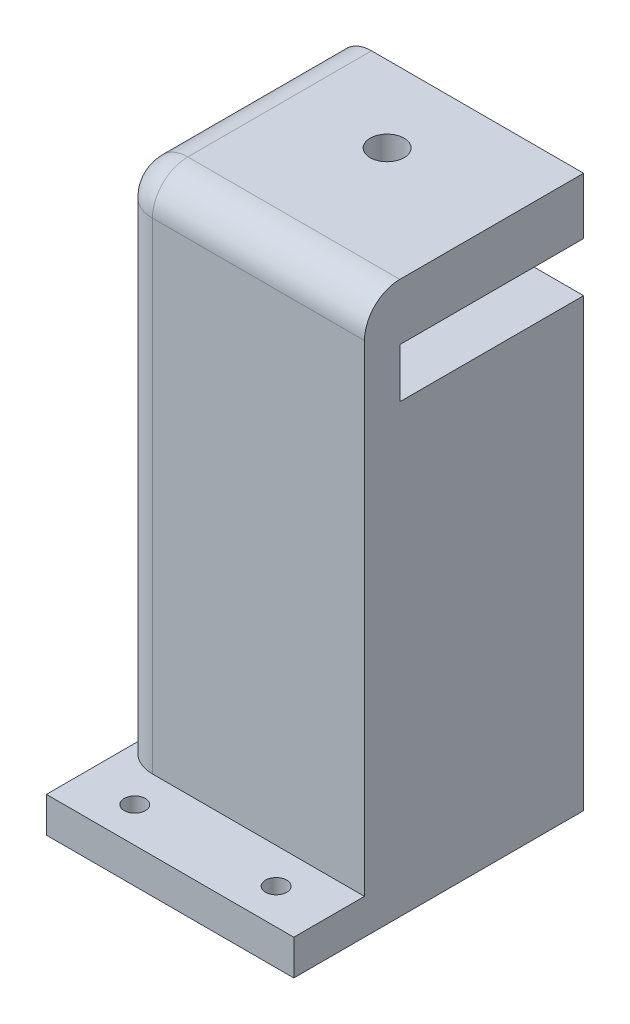
ISO-10303-21;
HEADER;
FILE_DESCRIPTION(('STEP AP214'),'2;1');
FILE_NAME('part.step','',(''),(''),'','','');
FILE_SCHEMA(('AUTOMOTIVE_DESIGN { 1 0 10303 214 1 1 1 1 }'));
ENDSEC;
DATA;
#1=APPLICATION_CONTEXT('core data for automotive mechanical design processes');
#2=APPLICATION_PROTOCOL_DEFINITION('international standard','automotive_design',2000,#1);
#3=PRODUCT_CONTEXT('',#1,'mechanical');
#4=PRODUCT('Part','Part','',(#3));
#5=PRODUCT_RELATED_PRODUCT_CATEGORY('part','',(#4));
#6=PRODUCT_DEFINITION_FORMATION('','',#4);
#7=PRODUCT_DEFINITION_CONTEXT('part definition',#1,'design');
#8=PRODUCT_DEFINITION('design','',#6,#7);
#9=PRODUCT_DEFINITION_SHAPE('','',#8);
#10=(LENGTH_UNIT() NAMED_UNIT(*) SI_UNIT(.MILLI.,.METRE.));
#11=(NAMED_UNIT(*) PLANE_ANGLE_UNIT() SI_UNIT($,.RADIAN.));
#12=(NAMED_UNIT(*) SI_UNIT($,.STERADIAN.) SOLID_ANGLE_UNIT());
#13=UNCERTAINTY_MEASURE_WITH_UNIT(LENGTH_MEASURE(1.E-05),#10,'distance_accuracy_value','');
#14=(GEOMETRIC_REPRESENTATION_CONTEXT(3) GLOBAL_UNCERTAINTY_ASSIGNED_CONTEXT((#13)) GLOBAL_UNIT_ASSIGNED_CONTEXT((#10,
#11,#12)) REPRESENTATION_CONTEXT('',''));
#15=CARTESIAN_POINT('',(0.,0.,0.));
#16=DIRECTION('',(0.,0.,1.));
#17=DIRECTION('',(1.,0.,0.));
#18=AXIS2_PLACEMENT_3D('',#15,#16,#17);
#19=CARTESIAN_POINT('',(0.,5.,0.));
#20=DIRECTION('',(0.,-1.,0.));
#21=DIRECTION('',(0.,0.,-1.));
#22=AXIS2_PLACEMENT_3D('',#19,#20,#21);
#23=PLANE('',#22);
#24=CARTESIAN_POINT('',(27.5,5.,-5.));
#25=DIRECTION('',(0.,1.,0.));
#26=DIRECTION('',(0.,0.,1.));
#27=AXIS2_PLACEMENT_3D('',#24,#25,#26);
#28=CIRCLE('',#27,1.5);
#29=CARTESIAN_POINT('',(27.5,5.,-3.5));
#30=VERTEX_POINT('',#29);
#31=EDGE_CURVE('E191',#30,#30,#28,.T.);
#32=ORIENTED_EDGE('',*,*,#31,.F.);
#33=EDGE_LOOP('',(#32));
#34=FACE_BOUND('',#33,.T.);
#35=CARTESIAN_POINT('',(7.5,5.,-5.));
#36=DIRECTION('',(0.,1.,0.));
#37=DIRECTION('',(0.,0.,1.));
#38=AXIS2_PLACEMENT_3D('',#35,#36,#37);
#39=CIRCLE('',#38,1.5);
#40=CARTESIAN_POINT('',(7.5,5.,-3.5));
#41=VERTEX_POINT('',#40);
#42=EDGE_CURVE('E196',#41,#41,#39,.T.);
#43=ORIENTED_EDGE('',*,*,#42,.F.);
#44=EDGE_LOOP('',(#43));
#45=FACE_BOUND('',#44,.T.);
#46=DIRECTION('',(1.,0.,0.));
#47=VECTOR('',#46,1.);
#48=CARTESIAN_POINT('',(0.,5.,-10.));
#49=LINE('',#48,#47);
#50=CARTESIAN_POINT('',(5.,5.,-10.));
#51=VERTEX_POINT('',#50);
#52=CARTESIAN_POINT('',(35.,5.,-10.));
#53=VERTEX_POINT('',#52);
#54=EDGE_CURVE('E178',#51,#53,#49,.T.);
#55=ORIENTED_EDGE('',*,*,#54,.F.);
#56=CARTESIAN_POINT('',(5.,5.,-15.));
#57=DIRECTION('',(0.,-1.,0.));
#58=DIRECTION('',(0.,0.,-1.));
#59=AXIS2_PLACEMENT_3D('',#56,#57,#58);
#60=CIRCLE('',#59,5.);
#61=CARTESIAN_POINT('',(0.,5.,-15.));
#62=VERTEX_POINT('',#61);
#63=EDGE_CURVE('E11',#51,#62,#60,.T.);
#64=ORIENTED_EDGE('',*,*,#63,.T.);
#65=DIRECTION('',(0.,0.,1.));
#66=VECTOR('',#65,1.);
#67=CARTESIAN_POINT('',(0.,5.,0.));
#68=LINE('',#67,#66);
#69=CARTESIAN_POINT('',(0.,5.,0.));
#70=VERTEX_POINT('',#69);
#71=EDGE_CURVE('E204',#62,#70,#68,.T.);
#72=ORIENTED_EDGE('',*,*,#71,.T.);
#73=DIRECTION('',(1.,0.,0.));
#74=VECTOR('',#73,1.);
#75=CARTESIAN_POINT('',(0.,5.,0.));
#76=LINE('',#75,#74);
#77=CARTESIAN_POINT('',(35.,5.,0.));
#78=VERTEX_POINT('',#77);
#79=EDGE_CURVE('E206',#70,#78,#76,.T.);
#80=ORIENTED_EDGE('',*,*,#79,.T.);
#81=DIRECTION('',(0.,0.,-1.));
#82=VECTOR('',#81,1.);
#83=CARTESIAN_POINT('',(35.,5.,0.));
#84=LINE('',#83,#82);
#85=EDGE_CURVE('E209',#78,#53,#84,.T.);
#86=ORIENTED_EDGE('',*,*,#85,.T.);
#87=EDGE_LOOP('',(#55,#64,#72,#80,#86));
#88=FACE_BOUND('',#87,.T.);
#89=ADVANCED_FACE('F43',(#34,#45,#88),#23,.F.);
#90=CARTESIAN_POINT('',(0.,5.,0.));
#91=DIRECTION('',(1.,0.,0.));
#92=DIRECTION('',(0.,0.,-1.));
#93=AXIS2_PLACEMENT_3D('',#90,#91,#92);
#94=PLANE('',#93);
#95=ORIENTED_EDGE('',*,*,#71,.F.);
#96=DIRECTION('',(0.,-1.,0.));
#97=VECTOR('',#96,1.);
#98=CARTESIAN_POINT('',(0.,5.,-15.));
#99=LINE('',#98,#97);
#100=CARTESIAN_POINT('',(0.,73.1,-15.));
#101=VERTEX_POINT('',#100);
#102=EDGE_CURVE('E244',#62,#101,#99,.F.);
#103=ORIENTED_EDGE('',*,*,#102,.T.);
#104=DIRECTION('',(0.,0.,1.));
#105=VECTOR('',#104,1.);
#106=CARTESIAN_POINT('',(0.,73.1,-41.));
#107=LINE('',#106,#105);
#108=CARTESIAN_POINT('',(0.,73.1,-41.));
#109=VERTEX_POINT('',#108);
#110=EDGE_CURVE('E235',#101,#109,#107,.F.);
#111=ORIENTED_EDGE('',*,*,#110,.T.);
#112=DIRECTION('',(0.,-1.,0.));
#113=VECTOR('',#112,1.);
#114=CARTESIAN_POINT('',(0.,5.,-41.));
#115=LINE('',#114,#113);
#116=CARTESIAN_POINT('',(0.,0.,-41.));
#117=VERTEX_POINT('',#116);
#118=EDGE_CURVE('E212',#109,#117,#115,.T.);
#119=ORIENTED_EDGE('',*,*,#118,.T.);
#120=DIRECTION('',(0.,0.,1.));
#121=VECTOR('',#120,1.);
#122=CARTESIAN_POINT('',(0.,0.,0.));
#123=LINE('',#122,#121);
#124=CARTESIAN_POINT('',(0.,0.,0.));
#125=VERTEX_POINT('',#124);
#126=EDGE_CURVE('E195',#117,#125,#123,.T.);
#127=ORIENTED_EDGE('',*,*,#126,.T.);
#128=DIRECTION('',(0.,-1.,0.));
#129=VECTOR('',#128,1.);
#130=CARTESIAN_POINT('',(0.,5.,0.));
#131=LINE('',#130,#129);
#132=EDGE_CURVE('E230',#70,#125,#131,.T.);
#133=ORIENTED_EDGE('',*,*,#132,.F.);
#134=EDGE_LOOP('',(#95,#103,#111,#119,#127,#133));
#135=FACE_BOUND('',#134,.T.);
#136=ADVANCED_FACE('F277',(#135),#94,.F.);
#137=CARTESIAN_POINT('',(0.,5.,0.));
#138=DIRECTION('',(0.,0.,-1.));
#139=DIRECTION('',(-1.,0.,0.));
#140=AXIS2_PLACEMENT_3D('',#137,#138,#139);
#141=PLANE('',#140);
#142=DIRECTION('',(1.,0.,0.));
#143=VECTOR('',#142,1.);
#144=CARTESIAN_POINT('',(0.,0.,0.));
#145=LINE('',#144,#143);
#146=CARTESIAN_POINT('',(35.,0.,0.));
#147=VERTEX_POINT('',#146);
#148=EDGE_CURVE('E215',#125,#147,#145,.T.);
#149=ORIENTED_EDGE('',*,*,#148,.T.);
#150=DIRECTION('',(0.,-1.,0.));
#151=VECTOR('',#150,1.);
#152=CARTESIAN_POINT('',(35.,5.,0.));
#153=LINE('',#152,#151);
#154=EDGE_CURVE('E227',#78,#147,#153,.T.);
#155=ORIENTED_EDGE('',*,*,#154,.F.);
#156=ORIENTED_EDGE('',*,*,#79,.F.);
#157=ORIENTED_EDGE('',*,*,#132,.T.);
#158=EDGE_LOOP('',(#149,#155,#156,#157));
#159=FACE_BOUND('',#158,.T.);
#160=ADVANCED_FACE('F283',(#159),#141,.F.);
#161=CARTESIAN_POINT('',(35.,5.,0.));
#162=DIRECTION('',(-1.,0.,0.));
#163=DIRECTION('',(0.,0.,1.));
#164=AXIS2_PLACEMENT_3D('',#161,#162,#163);
#165=PLANE('',#164);
#166=DIRECTION('',(0.,0.,-1.));
#167=VECTOR('',#166,1.);
#168=CARTESIAN_POINT('',(35.,78.1,-41.));
#169=LINE('',#168,#167);
#170=CARTESIAN_POINT('',(35.,78.1,-15.));
#171=VERTEX_POINT('',#170);
#172=CARTESIAN_POINT('',(35.,78.1,-41.));
#173=VERTEX_POINT('',#172);
#174=EDGE_CURVE('E182',#171,#173,#169,.T.);
#175=ORIENTED_EDGE('',*,*,#174,.F.);
#176=CARTESIAN_POINT('',(35.,73.1,-15.));
#177=DIRECTION('',(-1.,0.,0.));
#178=DIRECTION('',(0.,0.,1.));
#179=AXIS2_PLACEMENT_3D('',#176,#177,#178);
#180=CIRCLE('',#179,5.);
#181=CARTESIAN_POINT('',(35.,73.1,-10.));
#182=VERTEX_POINT('',#181);
#183=EDGE_CURVE('E52',#171,#182,#180,.F.);
#184=ORIENTED_EDGE('',*,*,#183,.T.);
#185=DIRECTION('',(0.,-1.,0.));
#186=VECTOR('',#185,1.);
#187=CARTESIAN_POINT('',(35.,78.1,-10.));
#188=LINE('',#187,#186);
#189=EDGE_CURVE('E187',#182,#53,#188,.T.);
#190=ORIENTED_EDGE('',*,*,#189,.T.);
#191=ORIENTED_EDGE('',*,*,#85,.F.);
#192=ORIENTED_EDGE('',*,*,#154,.T.);
#193=DIRECTION('',(0.,0.,-1.));
#194=VECTOR('',#193,1.);
#195=CARTESIAN_POINT('',(35.,0.,0.));
#196=LINE('',#195,#194);
#197=CARTESIAN_POINT('',(35.,0.,-41.));
#198=VERTEX_POINT('',#197);
#199=EDGE_CURVE('E217',#147,#198,#196,.T.);
#200=ORIENTED_EDGE('',*,*,#199,.T.);
#201=DIRECTION('',(0.,-1.,0.));
#202=VECTOR('',#201,1.);
#203=CARTESIAN_POINT('',(35.,5.,-41.));
#204=LINE('',#203,#202);
#205=CARTESIAN_POINT('',(35.,63.1,-41.));
#206=VERTEX_POINT('',#205);
#207=EDGE_CURVE('E223',#206,#198,#204,.T.);
#208=ORIENTED_EDGE('',*,*,#207,.F.);
#209=DIRECTION('',(0.,0.,-1.));
#210=VECTOR('',#209,1.);
#211=CARTESIAN_POINT('',(35.,63.1,-15.));
#212=LINE('',#211,#210);
#213=CARTESIAN_POINT('',(35.,63.1,-15.));
#214=VERTEX_POINT('',#213);
#215=EDGE_CURVE('E165',#214,#206,#212,.T.);
#216=ORIENTED_EDGE('',*,*,#215,.F.);
#217=DIRECTION('',(0.,-1.,0.));
#218=VECTOR('',#217,1.);
#219=CARTESIAN_POINT('',(35.,70.1,-15.));
#220=LINE('',#219,#218);
#221=CARTESIAN_POINT('',(35.,70.1,-15.));
#222=VERTEX_POINT('',#221);
#223=EDGE_CURVE('E146',#222,#214,#220,.T.);
#224=ORIENTED_EDGE('',*,*,#223,.F.);
#225=DIRECTION('',(0.,0.,1.));
#226=VECTOR('',#225,1.);
#227=CARTESIAN_POINT('',(35.,70.1,-15.));
#228=LINE('',#227,#226);
#229=CARTESIAN_POINT('',(35.,70.1,-41.));
#230=VERTEX_POINT('',#229);
#231=EDGE_CURVE('E162',#230,#222,#228,.T.);
#232=ORIENTED_EDGE('',*,*,#231,.F.);
#233=EDGE_CURVE('E224',#173,#230,#204,.T.);
#234=ORIENTED_EDGE('',*,*,#233,.F.);
#235=EDGE_LOOP('',(#175,#184,#190,#191,#192,#200,#208,#216,#224,#232,#234));
#236=FACE_BOUND('',#235,.T.);
#237=ADVANCED_FACE('F299',(#236),#165,.F.);
#238=CARTESIAN_POINT('',(0.,5.,-41.));
#239=DIRECTION('',(0.,0.,1.));
#240=DIRECTION('',(1.,0.,0.));
#241=AXIS2_PLACEMENT_3D('',#238,#239,#240);
#242=PLANE('',#241);
#243=ORIENTED_EDGE('',*,*,#118,.F.);
#244=CARTESIAN_POINT('',(5.,73.1,-41.));
#245=DIRECTION('',(0.,0.,1.));
#246=DIRECTION('',(1.,0.,0.));
#247=AXIS2_PLACEMENT_3D('',#244,#245,#246);
#248=CIRCLE('',#247,5.);
#249=CARTESIAN_POINT('',(5.,78.1,-41.));
#250=VERTEX_POINT('',#249);
#251=EDGE_CURVE('E237',#109,#250,#248,.F.);
#252=ORIENTED_EDGE('',*,*,#251,.T.);
#253=DIRECTION('',(-1.,0.,0.));
#254=VECTOR('',#253,1.);
#255=CARTESIAN_POINT('',(0.,78.1,-41.));
#256=LINE('',#255,#254);
#257=EDGE_CURVE('E184',#173,#250,#256,.T.);
#258=ORIENTED_EDGE('',*,*,#257,.F.);
#259=ORIENTED_EDGE('',*,*,#233,.T.);
#260=DIRECTION('',(1.,0.,0.));
#261=VECTOR('',#260,1.);
#262=CARTESIAN_POINT('',(5.,70.1,-41.));
#263=LINE('',#262,#261);
#264=CARTESIAN_POINT('',(5.,70.1,-41.));
#265=VERTEX_POINT('',#264);
#266=EDGE_CURVE('E179',#265,#230,#263,.T.);
#267=ORIENTED_EDGE('',*,*,#266,.F.);
#268=DIRECTION('',(0.,1.,0.));
#269=VECTOR('',#268,1.);
#270=CARTESIAN_POINT('',(5.,70.1,-41.));
#271=LINE('',#270,#269);
#272=CARTESIAN_POINT('',(5.,63.1,-41.));
#273=VERTEX_POINT('',#272);
#274=EDGE_CURVE('E158',#273,#265,#271,.T.);
#275=ORIENTED_EDGE('',*,*,#274,.F.);
#276=DIRECTION('',(1.,0.,0.));
#277=VECTOR('',#276,1.);
#278=CARTESIAN_POINT('',(5.,63.1,-41.));
#279=LINE('',#278,#277);
#280=EDGE_CURVE('E149',#273,#206,#279,.T.);
#281=ORIENTED_EDGE('',*,*,#280,.T.);
#282=ORIENTED_EDGE('',*,*,#207,.T.);
#283=DIRECTION('',(-1.,0.,0.));
#284=VECTOR('',#283,1.);
#285=CARTESIAN_POINT('',(0.,0.,-41.));
#286=LINE('',#285,#284);
#287=EDGE_CURVE('E207',#198,#117,#286,.T.);
#288=ORIENTED_EDGE('',*,*,#287,.T.);
#289=EDGE_LOOP('',(#243,#252,#258,#259,#267,#275,#281,#282,#288));
#290=FACE_BOUND('',#289,.T.);
#291=ADVANCED_FACE('F295',(#290),#242,.F.);
#292=CARTESIAN_POINT('',(0.,0.,0.));
#293=DIRECTION('',(0.,-1.,0.));
#294=DIRECTION('',(0.,0.,-1.));
#295=AXIS2_PLACEMENT_3D('',#292,#293,#294);
#296=PLANE('',#295);
#297=CARTESIAN_POINT('',(7.5,0.,-5.));
#298=DIRECTION('',(0.,1.,0.));
#299=DIRECTION('',(0.,0.,1.));
#300=AXIS2_PLACEMENT_3D('',#297,#298,#299);
#301=CIRCLE('',#300,1.5);
#302=CARTESIAN_POINT('',(7.5,0.,-3.5));
#303=VERTEX_POINT('',#302);
#304=EDGE_CURVE('E192',#303,#303,#301,.T.);
#305=ORIENTED_EDGE('',*,*,#304,.T.);
#306=EDGE_LOOP('',(#305));
#307=FACE_BOUND('',#306,.T.);
#308=CARTESIAN_POINT('',(27.5,0.,-5.));
#309=DIRECTION('',(0.,1.,0.));
#310=DIRECTION('',(0.,0.,1.));
#311=AXIS2_PLACEMENT_3D('',#308,#309,#310);
#312=CIRCLE('',#311,1.5);
#313=CARTESIAN_POINT('',(27.5,0.,-3.5));
#314=VERTEX_POINT('',#313);
#315=EDGE_CURVE('E199',#314,#314,#312,.T.);
#316=ORIENTED_EDGE('',*,*,#315,.T.);
#317=EDGE_LOOP('',(#316));
#318=FACE_BOUND('',#317,.T.);
#319=ORIENTED_EDGE('',*,*,#126,.F.);
#320=ORIENTED_EDGE('',*,*,#287,.F.);
#321=ORIENTED_EDGE('',*,*,#199,.F.);
#322=ORIENTED_EDGE('',*,*,#148,.F.);
#323=EDGE_LOOP('',(#319,#320,#321,#322));
#324=FACE_BOUND('',#323,.T.);
#325=ADVANCED_FACE('F292',(#307,#318,#324),#296,.T.);
#326=CARTESIAN_POINT('',(27.5,0.,-5.));
#327=DIRECTION('',(0.,1.,0.));
#328=DIRECTION('',(0.,0.,1.));
#329=AXIS2_PLACEMENT_3D('',#326,#327,#328);
#330=CYLINDRICAL_SURFACE('',#329,1.5);
#331=ORIENTED_EDGE('',*,*,#315,.F.);
#332=EDGE_LOOP('',(#331));
#333=FACE_BOUND('',#332,.T.);
#334=ORIENTED_EDGE('',*,*,#31,.T.);
#335=EDGE_LOOP('',(#334));
#336=FACE_BOUND('',#335,.T.);
#337=ADVANCED_FACE('F290',(#333,#336),#330,.F.);
#338=CARTESIAN_POINT('',(7.5,0.,-5.));
#339=DIRECTION('',(0.,1.,0.));
#340=DIRECTION('',(0.,0.,1.));
#341=AXIS2_PLACEMENT_3D('',#338,#339,#340);
#342=CYLINDRICAL_SURFACE('',#341,1.5);
#343=ORIENTED_EDGE('',*,*,#304,.F.);
#344=EDGE_LOOP('',(#343));
#345=FACE_BOUND('',#344,.T.);
#346=ORIENTED_EDGE('',*,*,#42,.T.);
#347=EDGE_LOOP('',(#346));
#348=FACE_BOUND('',#347,.T.);
#349=ADVANCED_FACE('F348',(#345,#348),#342,.F.);
#350=CARTESIAN_POINT('',(0.,78.1,-10.));
#351=DIRECTION('',(0.,0.,-1.));
#352=DIRECTION('',(-1.,0.,0.));
#353=AXIS2_PLACEMENT_3D('',#350,#351,#352);
#354=PLANE('',#353);
#355=DIRECTION('',(1.,0.,0.));
#356=VECTOR('',#355,1.);
#357=CARTESIAN_POINT('',(5.,73.1,-10.));
#358=LINE('',#357,#356);
#359=CARTESIAN_POINT('',(5.,73.1,-10.));
#360=VERTEX_POINT('',#359);
#361=EDGE_CURVE('E239',#182,#360,#358,.F.);
#362=ORIENTED_EDGE('',*,*,#361,.T.);
#363=DIRECTION('',(0.,-1.,0.));
#364=VECTOR('',#363,1.);
#365=CARTESIAN_POINT('',(5.,78.1,-10.));
#366=LINE('',#365,#364);
#367=EDGE_CURVE('E241',#360,#51,#366,.T.);
#368=ORIENTED_EDGE('',*,*,#367,.T.);
#369=ORIENTED_EDGE('',*,*,#54,.T.);
#370=ORIENTED_EDGE('',*,*,#189,.F.);
#371=EDGE_LOOP('',(#362,#368,#369,#370));
#372=FACE_BOUND('',#371,.T.);
#373=ADVANCED_FACE('F323',(#372),#354,.F.);
#374=CARTESIAN_POINT('',(0.,78.1,0.));
#375=DIRECTION('',(0.,1.,0.));
#376=DIRECTION('',(0.,0.,1.));
#377=AXIS2_PLACEMENT_3D('',#374,#375,#376);
#378=PLANE('',#377);
#379=CARTESIAN_POINT('',(18.,78.1,-30.202102686173));
#380=DIRECTION('',(0.,1.,0.));
#381=DIRECTION('',(0.,0.,1.));
#382=AXIS2_PLACEMENT_3D('',#379,#380,#381);
#383=CIRCLE('',#382,2.4);
#384=CARTESIAN_POINT('',(18.,78.1,-27.802102686173));
#385=VERTEX_POINT('',#384);
#386=EDGE_CURVE('E168',#385,#385,#383,.T.);
#387=ORIENTED_EDGE('',*,*,#386,.F.);
#388=EDGE_LOOP('',(#387));
#389=FACE_BOUND('',#388,.T.);
#390=DIRECTION('',(0.,0.,1.));
#391=VECTOR('',#390,1.);
#392=CARTESIAN_POINT('',(5.,78.1,-10.));
#393=LINE('',#392,#391);
#394=CARTESIAN_POINT('',(5.,78.1,-15.));
#395=VERTEX_POINT('',#394);
#396=EDGE_CURVE('E233',#250,#395,#393,.T.);
#397=ORIENTED_EDGE('',*,*,#396,.T.);
#398=DIRECTION('',(1.,0.,0.));
#399=VECTOR('',#398,1.);
#400=CARTESIAN_POINT('',(35.,78.1,-15.));
#401=LINE('',#400,#399);
#402=EDGE_CURVE('E60',#395,#171,#401,.T.);
#403=ORIENTED_EDGE('',*,*,#402,.T.);
#404=ORIENTED_EDGE('',*,*,#174,.T.);
#405=ORIENTED_EDGE('',*,*,#257,.T.);
#406=EDGE_LOOP('',(#397,#403,#404,#405));
#407=FACE_BOUND('',#406,.T.);
#408=ADVANCED_FACE('F338',(#389,#407),#378,.T.);
#409=CARTESIAN_POINT('',(5.,70.1,-15.));
#410=DIRECTION('',(0.,0.,1.));
#411=DIRECTION('',(0.,-1.,0.));
#412=AXIS2_PLACEMENT_3D('',#409,#410,#411);
#413=PLANE('',#412);
#414=ORIENTED_EDGE('',*,*,#223,.T.);
#415=DIRECTION('',(1.,0.,0.));
#416=VECTOR('',#415,1.);
#417=CARTESIAN_POINT('',(5.,63.1,-15.));
#418=LINE('',#417,#416);
#419=CARTESIAN_POINT('',(5.,63.1,-15.));
#420=VERTEX_POINT('',#419);
#421=EDGE_CURVE('E139',#420,#214,#418,.T.);
#422=ORIENTED_EDGE('',*,*,#421,.F.);
#423=DIRECTION('',(0.,-1.,0.));
#424=VECTOR('',#423,1.);
#425=CARTESIAN_POINT('',(5.,70.1,-15.));
#426=LINE('',#425,#424);
#427=CARTESIAN_POINT('',(5.,70.1,-15.));
#428=VERTEX_POINT('',#427);
#429=EDGE_CURVE('E143',#428,#420,#426,.T.);
#430=ORIENTED_EDGE('',*,*,#429,.F.);
#431=DIRECTION('',(1.,0.,0.));
#432=VECTOR('',#431,1.);
#433=CARTESIAN_POINT('',(5.,70.1,-15.));
#434=LINE('',#433,#432);
#435=EDGE_CURVE('E176',#428,#222,#434,.T.);
#436=ORIENTED_EDGE('',*,*,#435,.T.);
#437=EDGE_LOOP('',(#414,#422,#430,#436));
#438=FACE_BOUND('',#437,.T.);
#439=ADVANCED_FACE('F141',(#438),#413,.F.);
#440=CARTESIAN_POINT('',(5.,70.1,-15.));
#441=DIRECTION('',(0.,1.,0.));
#442=DIRECTION('',(0.,0.,1.));
#443=AXIS2_PLACEMENT_3D('',#440,#441,#442);
#444=PLANE('',#443);
#445=CARTESIAN_POINT('',(18.,70.1,-30.202102686173));
#446=DIRECTION('',(0.,1.,0.));
#447=DIRECTION('',(0.,0.,1.));
#448=AXIS2_PLACEMENT_3D('',#445,#446,#447);
#449=CIRCLE('',#448,2.4);
#450=CARTESIAN_POINT('',(18.,70.1,-27.802102686173));
#451=VERTEX_POINT('',#450);
#452=EDGE_CURVE('E174',#451,#451,#449,.T.);
#453=ORIENTED_EDGE('',*,*,#452,.T.);
#454=EDGE_LOOP('',(#453));
#455=FACE_BOUND('',#454,.T.);
#456=ORIENTED_EDGE('',*,*,#231,.T.);
#457=ORIENTED_EDGE('',*,*,#435,.F.);
#458=DIRECTION('',(0.,0.,1.));
#459=VECTOR('',#458,1.);
#460=CARTESIAN_POINT('',(5.,70.1,-15.));
#461=LINE('',#460,#459);
#462=EDGE_CURVE('E150',#265,#428,#461,.T.);
#463=ORIENTED_EDGE('',*,*,#462,.F.);
#464=ORIENTED_EDGE('',*,*,#266,.T.);
#465=EDGE_LOOP('',(#456,#457,#463,#464));
#466=FACE_BOUND('',#465,.T.);
#467=ADVANCED_FACE('F263',(#455,#466),#444,.F.);
#468=CARTESIAN_POINT('',(5.,63.1,-15.));
#469=DIRECTION('',(0.,-1.,0.));
#470=DIRECTION('',(0.,0.,-1.));
#471=AXIS2_PLACEMENT_3D('',#468,#469,#470);
#472=PLANE('',#471);
#473=ORIENTED_EDGE('',*,*,#215,.T.);
#474=ORIENTED_EDGE('',*,*,#280,.F.);
#475=DIRECTION('',(0.,0.,-1.));
#476=VECTOR('',#475,1.);
#477=CARTESIAN_POINT('',(5.,63.1,-15.));
#478=LINE('',#477,#476);
#479=EDGE_CURVE('E153',#420,#273,#478,.T.);
#480=ORIENTED_EDGE('',*,*,#479,.F.);
#481=ORIENTED_EDGE('',*,*,#421,.T.);
#482=EDGE_LOOP('',(#473,#474,#480,#481));
#483=FACE_BOUND('',#482,.T.);
#484=ADVANCED_FACE('F154',(#483),#472,.F.);
#485=CARTESIAN_POINT('',(5.,0.,0.));
#486=DIRECTION('',(1.,0.,0.));
#487=DIRECTION('',(0.,0.,-1.));
#488=AXIS2_PLACEMENT_3D('',#485,#486,#487);
#489=PLANE('',#488);
#490=ORIENTED_EDGE('',*,*,#429,.T.);
#491=ORIENTED_EDGE('',*,*,#479,.T.);
#492=ORIENTED_EDGE('',*,*,#274,.T.);
#493=ORIENTED_EDGE('',*,*,#462,.T.);
#494=EDGE_LOOP('',(#490,#491,#492,#493));
#495=FACE_BOUND('',#494,.T.);
#496=ADVANCED_FACE('F160',(#495),#489,.T.);
#497=CARTESIAN_POINT('',(18.,70.1,-30.202102686173));
#498=DIRECTION('',(0.,1.,0.));
#499=DIRECTION('',(0.,0.,1.));
#500=AXIS2_PLACEMENT_3D('',#497,#498,#499);
#501=CYLINDRICAL_SURFACE('',#500,2.4);
#502=ORIENTED_EDGE('',*,*,#452,.F.);
#503=EDGE_LOOP('',(#502));
#504=FACE_BOUND('',#503,.T.);
#505=ORIENTED_EDGE('',*,*,#386,.T.);
#506=EDGE_LOOP('',(#505));
#507=FACE_BOUND('',#506,.T.);
#508=ADVANCED_FACE('F266',(#504,#507),#501,.F.);
#509=CARTESIAN_POINT('',(5.,73.1,0.));
#510=DIRECTION('',(0.,0.,-1.));
#511=DIRECTION('',(-1.,0.,0.));
#512=AXIS2_PLACEMENT_3D('',#509,#510,#511);
#513=CYLINDRICAL_SURFACE('',#512,5.);
#514=ORIENTED_EDGE('',*,*,#110,.F.);
#515=CARTESIAN_POINT('',(5.,73.1,-15.));
#516=DIRECTION('',(0.,0.,-1.));
#517=DIRECTION('',(-1.,0.,0.));
#518=AXIS2_PLACEMENT_3D('',#515,#516,#517);
#519=CIRCLE('',#518,5.);
#520=EDGE_CURVE('E68',#101,#395,#519,.T.);
#521=ORIENTED_EDGE('',*,*,#520,.T.);
#522=ORIENTED_EDGE('',*,*,#396,.F.);
#523=ORIENTED_EDGE('',*,*,#251,.F.);
#524=EDGE_LOOP('',(#514,#521,#522,#523));
#525=FACE_BOUND('',#524,.T.);
#526=ADVANCED_FACE('F268',(#525),#513,.T.);
#527=CARTESIAN_POINT('',(0.,73.1,-15.));
#528=DIRECTION('',(-1.,0.,0.));
#529=DIRECTION('',(0.,0.,1.));
#530=AXIS2_PLACEMENT_3D('',#527,#528,#529);
#531=CYLINDRICAL_SURFACE('',#530,5.);
#532=ORIENTED_EDGE('',*,*,#183,.F.);
#533=ORIENTED_EDGE('',*,*,#402,.F.);
#534=CARTESIAN_POINT('',(5.,73.1,-15.));
#535=DIRECTION('',(-1.,0.,0.));
#536=DIRECTION('',(0.,0.,1.));
#537=AXIS2_PLACEMENT_3D('',#534,#535,#536);
#538=CIRCLE('',#537,5.);
#539=EDGE_CURVE('E47',#360,#395,#538,.T.);
#540=ORIENTED_EDGE('',*,*,#539,.F.);
#541=ORIENTED_EDGE('',*,*,#361,.F.);
#542=EDGE_LOOP('',(#532,#533,#540,#541));
#543=FACE_BOUND('',#542,.T.);
#544=ADVANCED_FACE('F45',(#543),#531,.T.);
#545=CARTESIAN_POINT('',(5.,73.1,-15.));
#546=DIRECTION('',(0.,0.,-1.));
#547=DIRECTION('',(-1.,0.,0.));
#548=AXIS2_PLACEMENT_3D('',#545,#546,#547);
#549=SPHERICAL_SURFACE('',#548,5.);
#550=ORIENTED_EDGE('',*,*,#539,.T.);
#551=ORIENTED_EDGE('',*,*,#520,.F.);
#552=CARTESIAN_POINT('',(5.,73.1,-15.));
#553=DIRECTION('',(0.,-1.,0.));
#554=DIRECTION('',(0.,0.,-1.));
#555=AXIS2_PLACEMENT_3D('',#552,#553,#554);
#556=CIRCLE('',#555,5.);
#557=EDGE_CURVE('E248',#360,#101,#556,.T.);
#558=ORIENTED_EDGE('',*,*,#557,.F.);
#559=EDGE_LOOP('',(#550,#551,#558));
#560=FACE_BOUND('',#559,.T.);
#561=ADVANCED_FACE('F309',(#560),#549,.T.);
#562=CARTESIAN_POINT('',(5.,78.1,-15.));
#563=DIRECTION('',(0.,-1.,0.));
#564=DIRECTION('',(0.,0.,-1.));
#565=AXIS2_PLACEMENT_3D('',#562,#563,#564);
#566=CYLINDRICAL_SURFACE('',#565,5.);
#567=ORIENTED_EDGE('',*,*,#557,.T.);
#568=ORIENTED_EDGE('',*,*,#102,.F.);
#569=ORIENTED_EDGE('',*,*,#63,.F.);
#570=ORIENTED_EDGE('',*,*,#367,.F.);
#571=EDGE_LOOP('',(#567,#568,#569,#570));
#572=FACE_BOUND('',#571,.T.);
#573=ADVANCED_FACE('F307',(#572),#566,.T.);
#574=CLOSED_SHELL('',(#89,#136,#160,#237,#291,#325,#337,#349,#373,#408,#439,#467,#484,#496,#508,
#526,#544,#561,#573));
#575=MANIFOLD_SOLID_BREP('B2',#574);
#576=ADVANCED_BREP_SHAPE_REPRESENTATION('',(#18,#575),#14);
#577=SHAPE_DEFINITION_REPRESENTATION(#9,#576);
ENDSEC;
END-ISO-10303-21;
